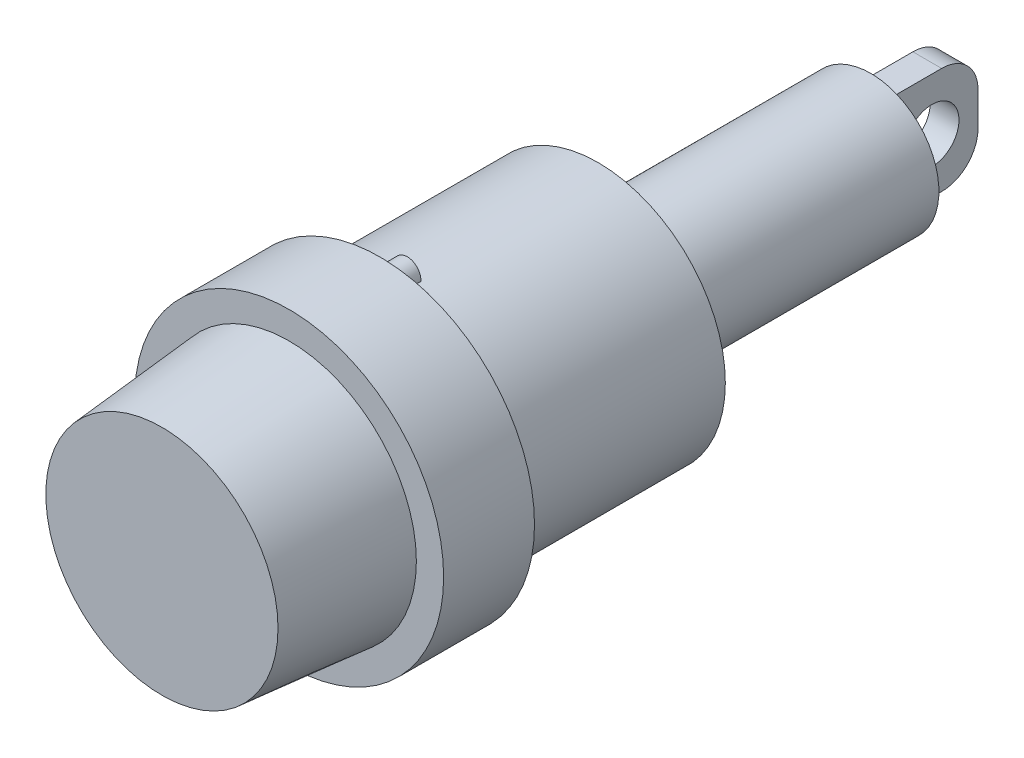
ISO-10303-21;
HEADER;
FILE_DESCRIPTION(('STEP AP214'),'2;1');
FILE_NAME('part.step','',(''),(''),'','','');
FILE_SCHEMA(('AUTOMOTIVE_DESIGN { 1 0 10303 214 1 1 1 1 }'));
ENDSEC;
DATA;
#1=APPLICATION_CONTEXT('core data for automotive mechanical design processes');
#2=APPLICATION_PROTOCOL_DEFINITION('international standard','automotive_design',2000,#1);
#3=PRODUCT_CONTEXT('',#1,'mechanical');
#4=PRODUCT('Part','Part','',(#3));
#5=PRODUCT_RELATED_PRODUCT_CATEGORY('part','',(#4));
#6=PRODUCT_DEFINITION_FORMATION('','',#4);
#7=PRODUCT_DEFINITION_CONTEXT('part definition',#1,'design');
#8=PRODUCT_DEFINITION('design','',#6,#7);
#9=PRODUCT_DEFINITION_SHAPE('','',#8);
#10=(LENGTH_UNIT() NAMED_UNIT(*) SI_UNIT(.MILLI.,.METRE.));
#11=(NAMED_UNIT(*) PLANE_ANGLE_UNIT() SI_UNIT($,.RADIAN.));
#12=(NAMED_UNIT(*) SI_UNIT($,.STERADIAN.) SOLID_ANGLE_UNIT());
#13=UNCERTAINTY_MEASURE_WITH_UNIT(LENGTH_MEASURE(1.E-05),#10,'distance_accuracy_value','');
#14=(GEOMETRIC_REPRESENTATION_CONTEXT(3) GLOBAL_UNCERTAINTY_ASSIGNED_CONTEXT((#13)) GLOBAL_UNIT_ASSIGNED_CONTEXT((#10,
#11,#12)) REPRESENTATION_CONTEXT('',''));
#15=CARTESIAN_POINT('',(0.,0.,0.));
#16=DIRECTION('',(0.,0.,1.));
#17=DIRECTION('',(1.,0.,0.));
#18=AXIS2_PLACEMENT_3D('',#15,#16,#17);
#19=CARTESIAN_POINT('',(0.,0.,0.));
#20=DIRECTION('',(0.,0.,1.));
#21=DIRECTION('',(1.,0.,0.));
#22=AXIS2_PLACEMENT_3D('',#19,#20,#21);
#23=PLANE('',#22);
#24=CARTESIAN_POINT('',(0.,0.,0.));
#25=DIRECTION('',(0.,0.,1.));
#26=DIRECTION('',(1.,0.,0.));
#27=AXIS2_PLACEMENT_3D('',#24,#25,#26);
#28=CIRCLE('',#27,8.5);
#29=CARTESIAN_POINT('',(8.5,0.,0.));
#30=VERTEX_POINT('',#29);
#31=EDGE_CURVE('E117',#30,#30,#28,.T.);
#32=ORIENTED_EDGE('',*,*,#31,.F.);
#33=EDGE_LOOP('',(#32));
#34=FACE_BOUND('',#33,.T.);
#35=CARTESIAN_POINT('',(0.,7.01066831383693,0.));
#36=DIRECTION('',(0.,0.,-1.));
#37=DIRECTION('',(-1.,0.,0.));
#38=AXIS2_PLACEMENT_3D('',#35,#36,#37);
#39=CIRCLE('',#38,0.75);
#40=CARTESIAN_POINT('',(-0.748279114072916,6.95989068645782,0.));
#41=VERTEX_POINT('',#40);
#42=CARTESIAN_POINT('',(0.748279114072916,6.95989068645782,0.));
#43=VERTEX_POINT('',#42);
#44=EDGE_CURVE('E97',#41,#43,#39,.T.);
#45=ORIENTED_EDGE('',*,*,#44,.F.);
#46=CARTESIAN_POINT('',(0.,0.,0.));
#47=DIRECTION('',(0.,0.,1.));
#48=DIRECTION('',(1.,0.,0.));
#49=AXIS2_PLACEMENT_3D('',#46,#47,#48);
#50=CIRCLE('',#49,7.);
#51=EDGE_CURVE('E108',#43,#41,#50,.F.);
#52=ORIENTED_EDGE('',*,*,#51,.F.);
#53=EDGE_LOOP('',(#45,#52));
#54=FACE_BOUND('',#53,.T.);
#55=ADVANCED_FACE('F34',(#34,#54),#23,.F.);
#56=CARTESIAN_POINT('',(0.,0.,-12.));
#57=DIRECTION('',(0.,0.,1.));
#58=DIRECTION('',(1.,0.,0.));
#59=AXIS2_PLACEMENT_3D('',#56,#57,#58);
#60=CYLINDRICAL_SURFACE('',#59,7.);
#61=CARTESIAN_POINT('',(0.,0.,-12.));
#62=DIRECTION('',(0.,0.,-1.));
#63=DIRECTION('',(-1.,0.,0.));
#64=AXIS2_PLACEMENT_3D('',#61,#62,#63);
#65=CIRCLE('',#64,7.);
#66=CARTESIAN_POINT('',(-7.,0.,-12.));
#67=VERTEX_POINT('',#66);
#68=EDGE_CURVE('E188',#67,#67,#65,.T.);
#69=ORIENTED_EDGE('',*,*,#68,.F.);
#70=EDGE_LOOP('',(#69));
#71=FACE_BOUND('',#70,.T.);
#72=DIRECTION('',(0.,0.,1.));
#73=VECTOR('',#72,1.);
#74=CARTESIAN_POINT('',(-0.748279114072916,6.95989068645782,-0.75));
#75=LINE('',#74,#73);
#76=CARTESIAN_POINT('',(-0.748279114072916,6.95989068645782,-1.5));
#77=VERTEX_POINT('',#76);
#78=EDGE_CURVE('E11',#77,#41,#75,.T.);
#79=ORIENTED_EDGE('',*,*,#78,.F.);
#80=CARTESIAN_POINT('',(0.,0.,-1.5));
#81=DIRECTION('',(0.,0.,-1.));
#82=DIRECTION('',(-1.,0.,0.));
#83=AXIS2_PLACEMENT_3D('',#80,#81,#82);
#84=CIRCLE('',#83,7.);
#85=CARTESIAN_POINT('',(0.748279114072916,6.95989068645782,-1.5));
#86=VERTEX_POINT('',#85);
#87=EDGE_CURVE('E109',#77,#86,#84,.T.);
#88=ORIENTED_EDGE('',*,*,#87,.T.);
#89=DIRECTION('',(0.,0.,1.));
#90=VECTOR('',#89,1.);
#91=CARTESIAN_POINT('',(0.748279114072916,6.95989068645782,-0.75));
#92=LINE('',#91,#90);
#93=EDGE_CURVE('E42',#43,#86,#92,.F.);
#94=ORIENTED_EDGE('',*,*,#93,.F.);
#95=ORIENTED_EDGE('',*,*,#51,.T.);
#96=EDGE_LOOP('',(#79,#88,#94,#95));
#97=FACE_BOUND('',#96,.T.);
#98=ADVANCED_FACE('F107',(#71,#97),#60,.T.);
#99=CARTESIAN_POINT('',(0.,0.,-27.));
#100=DIRECTION('',(0.,0.,-1.));
#101=DIRECTION('',(-1.,0.,0.));
#102=AXIS2_PLACEMENT_3D('',#99,#100,#101);
#103=PLANE('',#102);
#104=CARTESIAN_POINT('',(0.,0.,-27.));
#105=DIRECTION('',(0.,0.,-1.));
#106=DIRECTION('',(-1.,0.,0.));
#107=AXIS2_PLACEMENT_3D('',#104,#105,#106);
#108=CIRCLE('',#107,3.75);
#109=CARTESIAN_POINT('',(-3.75,0.,-27.));
#110=VERTEX_POINT('',#109);
#111=EDGE_CURVE('E185',#110,#110,#108,.T.);
#112=ORIENTED_EDGE('',*,*,#111,.T.);
#113=EDGE_LOOP('',(#112));
#114=FACE_BOUND('',#113,.T.);
#115=DIRECTION('',(-1.,0.,0.));
#116=VECTOR('',#115,1.);
#117=CARTESIAN_POINT('',(0.901291343113623,-2.93469254404056,-27.));
#118=LINE('',#117,#116);
#119=CARTESIAN_POINT('',(0.901291343113623,-2.93469254404056,-27.));
#120=VERTEX_POINT('',#119);
#121=CARTESIAN_POINT('',(-0.681464186256642,-2.93469254404056,-27.));
#122=VERTEX_POINT('',#121);
#123=EDGE_CURVE('E176',#120,#122,#118,.T.);
#124=ORIENTED_EDGE('',*,*,#123,.F.);
#125=DIRECTION('',(0.,-1.,0.));
#126=VECTOR('',#125,1.);
#127=CARTESIAN_POINT('',(0.901291343113623,2.93469254404083,-27.));
#128=LINE('',#127,#126);
#129=CARTESIAN_POINT('',(0.901291343113623,2.93469254404083,-27.));
#130=VERTEX_POINT('',#129);
#131=EDGE_CURVE('E123',#130,#120,#128,.T.);
#132=ORIENTED_EDGE('',*,*,#131,.F.);
#133=DIRECTION('',(1.,0.,0.));
#134=VECTOR('',#133,1.);
#135=CARTESIAN_POINT('',(0.901291343113623,2.93469254404083,-27.));
#136=LINE('',#135,#134);
#137=CARTESIAN_POINT('',(-0.681464186256642,2.93469254404083,-27.));
#138=VERTEX_POINT('',#137);
#139=EDGE_CURVE('E168',#138,#130,#136,.T.);
#140=ORIENTED_EDGE('',*,*,#139,.F.);
#141=DIRECTION('',(0.,1.,0.));
#142=VECTOR('',#141,1.);
#143=CARTESIAN_POINT('',(-0.681464186256642,2.93469254404083,-27.));
#144=LINE('',#143,#142);
#145=EDGE_CURVE('E154',#122,#138,#144,.T.);
#146=ORIENTED_EDGE('',*,*,#145,.F.);
#147=EDGE_LOOP('',(#124,#132,#140,#146));
#148=FACE_BOUND('',#147,.T.);
#149=ADVANCED_FACE('F210',(#114,#148),#103,.T.);
#150=CARTESIAN_POINT('',(0.,0.,-12.));
#151=DIRECTION('',(0.,0.,-1.));
#152=DIRECTION('',(-1.,0.,0.));
#153=AXIS2_PLACEMENT_3D('',#150,#151,#152);
#154=PLANE('',#153);
#155=ORIENTED_EDGE('',*,*,#68,.T.);
#156=EDGE_LOOP('',(#155));
#157=FACE_BOUND('',#156,.T.);
#158=CARTESIAN_POINT('',(0.,0.,-12.));
#159=DIRECTION('',(0.,0.,-1.));
#160=DIRECTION('',(-1.,0.,0.));
#161=AXIS2_PLACEMENT_3D('',#158,#159,#160);
#162=CIRCLE('',#161,3.75);
#163=CARTESIAN_POINT('',(-3.75,0.,-12.));
#164=VERTEX_POINT('',#163);
#165=EDGE_CURVE('E184',#164,#164,#162,.T.);
#166=ORIENTED_EDGE('',*,*,#165,.F.);
#167=EDGE_LOOP('',(#166));
#168=FACE_BOUND('',#167,.T.);
#169=ADVANCED_FACE('F238',(#157,#168),#154,.T.);
#170=CARTESIAN_POINT('',(0.,0.,5.));
#171=DIRECTION('',(0.,0.,1.));
#172=DIRECTION('',(1.,0.,0.));
#173=AXIS2_PLACEMENT_3D('',#170,#171,#172);
#174=PLANE('',#173);
#175=CARTESIAN_POINT('',(0.,0.,5.));
#176=DIRECTION('',(0.,0.,1.));
#177=DIRECTION('',(1.,0.,0.));
#178=AXIS2_PLACEMENT_3D('',#175,#176,#177);
#179=CIRCLE('',#178,8.5);
#180=CARTESIAN_POINT('',(8.5,0.,5.));
#181=VERTEX_POINT('',#180);
#182=EDGE_CURVE('E111',#181,#181,#179,.T.);
#183=ORIENTED_EDGE('',*,*,#182,.T.);
#184=EDGE_LOOP('',(#183));
#185=FACE_BOUND('',#184,.T.);
#186=CARTESIAN_POINT('',(0.,0.,5.));
#187=DIRECTION('',(0.,0.,1.));
#188=DIRECTION('',(1.,0.,0.));
#189=AXIS2_PLACEMENT_3D('',#186,#187,#188);
#190=CIRCLE('',#189,7.);
#191=CARTESIAN_POINT('',(7.,0.,5.));
#192=VERTEX_POINT('',#191);
#193=EDGE_CURVE('E193',#192,#192,#190,.T.);
#194=ORIENTED_EDGE('',*,*,#193,.F.);
#195=EDGE_LOOP('',(#194));
#196=FACE_BOUND('',#195,.T.);
#197=ADVANCED_FACE('F215',(#185,#196),#174,.T.);
#198=CARTESIAN_POINT('',(0.,0.,5.));
#199=DIRECTION('',(0.,0.,-1.));
#200=DIRECTION('',(-1.,0.,0.));
#201=AXIS2_PLACEMENT_3D('',#198,#199,#200);
#202=CYLINDRICAL_SURFACE('',#201,8.5);
#203=ORIENTED_EDGE('',*,*,#182,.F.);
#204=EDGE_LOOP('',(#203));
#205=FACE_BOUND('',#204,.T.);
#206=ORIENTED_EDGE('',*,*,#31,.T.);
#207=EDGE_LOOP('',(#206));
#208=FACE_BOUND('',#207,.T.);
#209=ADVANCED_FACE('F203',(#205,#208),#202,.T.);
#210=CARTESIAN_POINT('',(0.,0.,5.));
#211=DIRECTION('',(0.,0.,-1.));
#212=DIRECTION('',(1.,0.,0.));
#213=AXIS2_PLACEMENT_3D('',#210,#211,#212);
#214=CONICAL_SURFACE('',#213,7.,0.0872664625997167);
#215=CARTESIAN_POINT('',(0.,0.,12.));
#216=DIRECTION('',(0.,0.,1.));
#217=DIRECTION('',(1.,0.,0.));
#218=AXIS2_PLACEMENT_3D('',#215,#216,#217);
#219=CIRCLE('',#218,6.38757935531853);
#220=CARTESIAN_POINT('',(6.38757935531853,0.,12.));
#221=VERTEX_POINT('',#220);
#222=EDGE_CURVE('E196',#221,#221,#219,.T.);
#223=ORIENTED_EDGE('',*,*,#222,.F.);
#224=EDGE_LOOP('',(#223));
#225=FACE_BOUND('',#224,.T.);
#226=ORIENTED_EDGE('',*,*,#193,.T.);
#227=EDGE_LOOP('',(#226));
#228=FACE_BOUND('',#227,.T.);
#229=ADVANCED_FACE('F218',(#225,#228),#214,.T.);
#230=CARTESIAN_POINT('',(0.,0.,12.));
#231=DIRECTION('',(0.,0.,1.));
#232=DIRECTION('',(1.,0.,0.));
#233=AXIS2_PLACEMENT_3D('',#230,#231,#232);
#234=PLANE('',#233);
#235=ORIENTED_EDGE('',*,*,#222,.T.);
#236=EDGE_LOOP('',(#235));
#237=FACE_BOUND('',#236,.T.);
#238=ADVANCED_FACE('F251',(#237),#234,.T.);
#239=CARTESIAN_POINT('',(0.,0.,-27.));
#240=DIRECTION('',(0.,0.,1.));
#241=DIRECTION('',(1.,0.,0.));
#242=AXIS2_PLACEMENT_3D('',#239,#240,#241);
#243=CYLINDRICAL_SURFACE('',#242,3.75);
#244=ORIENTED_EDGE('',*,*,#111,.F.);
#245=EDGE_LOOP('',(#244));
#246=FACE_BOUND('',#245,.T.);
#247=ORIENTED_EDGE('',*,*,#165,.T.);
#248=EDGE_LOOP('',(#247));
#249=FACE_BOUND('',#248,.T.);
#250=ADVANCED_FACE('F249',(#246,#249),#243,.T.);
#251=CARTESIAN_POINT('',(0.901291343113623,2.93469254404083,-32.));
#252=DIRECTION('',(-1.,0.,0.));
#253=DIRECTION('',(0.,0.,1.));
#254=AXIS2_PLACEMENT_3D('',#251,#252,#253);
#255=PLANE('',#254);
#256=CARTESIAN_POINT('',(0.901291343113623,0.,-29.4674951634494));
#257=DIRECTION('',(1.,0.,0.));
#258=DIRECTION('',(0.,0.,-1.));
#259=AXIS2_PLACEMENT_3D('',#256,#257,#258);
#260=CIRCLE('',#259,1.48410827691468);
#261=CARTESIAN_POINT('',(0.901291343113623,0.,-30.9516034403641));
#262=VERTEX_POINT('',#261);
#263=EDGE_CURVE('E124',#262,#262,#260,.T.);
#264=ORIENTED_EDGE('',*,*,#263,.F.);
#265=EDGE_LOOP('',(#264));
#266=FACE_BOUND('',#265,.T.);
#267=DIRECTION('',(0.,0.,1.));
#268=VECTOR('',#267,1.);
#269=CARTESIAN_POINT('',(0.901291343113623,-2.93469254404056,-32.));
#270=LINE('',#269,#268);
#271=CARTESIAN_POINT('',(0.901291343113623,-2.93469254404056,-30.));
#272=VERTEX_POINT('',#271);
#273=EDGE_CURVE('E182',#272,#120,#270,.T.);
#274=ORIENTED_EDGE('',*,*,#273,.F.);
#275=CARTESIAN_POINT('',(0.901291343113623,-0.934692544040557,-30.));
#276=DIRECTION('',(-1.,0.,0.));
#277=DIRECTION('',(0.,0.,1.));
#278=AXIS2_PLACEMENT_3D('',#275,#276,#277);
#279=CIRCLE('',#278,2.);
#280=CARTESIAN_POINT('',(0.901291343113623,-0.934692544040557,-32.));
#281=VERTEX_POINT('',#280);
#282=EDGE_CURVE('E135',#272,#281,#279,.F.);
#283=ORIENTED_EDGE('',*,*,#282,.T.);
#284=DIRECTION('',(0.,-1.,0.));
#285=VECTOR('',#284,1.);
#286=CARTESIAN_POINT('',(0.901291343113623,2.93469254404083,-32.));
#287=LINE('',#286,#285);
#288=CARTESIAN_POINT('',(0.901291343113623,0.934692544040831,-32.));
#289=VERTEX_POINT('',#288);
#290=EDGE_CURVE('E162',#289,#281,#287,.T.);
#291=ORIENTED_EDGE('',*,*,#290,.F.);
#292=CARTESIAN_POINT('',(0.901291343113623,0.934692544040831,-30.));
#293=DIRECTION('',(-1.,0.,0.));
#294=DIRECTION('',(0.,0.,1.));
#295=AXIS2_PLACEMENT_3D('',#292,#293,#294);
#296=CIRCLE('',#295,2.);
#297=CARTESIAN_POINT('',(0.901291343113623,2.93469254404083,-30.));
#298=VERTEX_POINT('',#297);
#299=EDGE_CURVE('E56',#289,#298,#296,.F.);
#300=ORIENTED_EDGE('',*,*,#299,.T.);
#301=DIRECTION('',(0.,0.,1.));
#302=VECTOR('',#301,1.);
#303=CARTESIAN_POINT('',(0.901291343113623,2.93469254404083,-32.));
#304=LINE('',#303,#302);
#305=EDGE_CURVE('E146',#298,#130,#304,.T.);
#306=ORIENTED_EDGE('',*,*,#305,.T.);
#307=ORIENTED_EDGE('',*,*,#131,.T.);
#308=EDGE_LOOP('',(#274,#283,#291,#300,#306,#307));
#309=FACE_BOUND('',#308,.T.);
#310=ADVANCED_FACE('F166',(#266,#309),#255,.F.);
#311=CARTESIAN_POINT('',(0.901291343113623,-2.93469254404056,-32.));
#312=DIRECTION('',(0.,1.,0.));
#313=DIRECTION('',(0.,0.,1.));
#314=AXIS2_PLACEMENT_3D('',#311,#312,#313);
#315=PLANE('',#314);
#316=DIRECTION('',(0.,0.,1.));
#317=VECTOR('',#316,1.);
#318=CARTESIAN_POINT('',(-0.681464186256642,-2.93469254404056,-32.));
#319=LINE('',#318,#317);
#320=CARTESIAN_POINT('',(-0.681464186256642,-2.93469254404056,-30.));
#321=VERTEX_POINT('',#320);
#322=EDGE_CURVE('E156',#321,#122,#319,.T.);
#323=ORIENTED_EDGE('',*,*,#322,.F.);
#324=DIRECTION('',(-1.,0.,0.));
#325=VECTOR('',#324,1.);
#326=CARTESIAN_POINT('',(0.901291343113623,-2.93469254404056,-30.));
#327=LINE('',#326,#325);
#328=EDGE_CURVE('E132',#321,#272,#327,.F.);
#329=ORIENTED_EDGE('',*,*,#328,.T.);
#330=ORIENTED_EDGE('',*,*,#273,.T.);
#331=ORIENTED_EDGE('',*,*,#123,.T.);
#332=EDGE_LOOP('',(#323,#329,#330,#331));
#333=FACE_BOUND('',#332,.T.);
#334=ADVANCED_FACE('F233',(#333),#315,.F.);
#335=CARTESIAN_POINT('',(-0.681464186256642,2.93469254404083,-32.));
#336=DIRECTION('',(1.,0.,0.));
#337=DIRECTION('',(0.,0.,-1.));
#338=AXIS2_PLACEMENT_3D('',#335,#336,#337);
#339=PLANE('',#338);
#340=CARTESIAN_POINT('',(-0.681464186256642,0.,-29.4674951634494));
#341=DIRECTION('',(1.,0.,0.));
#342=DIRECTION('',(0.,0.,-1.));
#343=AXIS2_PLACEMENT_3D('',#340,#341,#342);
#344=CIRCLE('',#343,1.48410827691468);
#345=CARTESIAN_POINT('',(-0.681464186256642,0.,-30.9516034403641));
#346=VERTEX_POINT('',#345);
#347=EDGE_CURVE('E121',#346,#346,#344,.T.);
#348=ORIENTED_EDGE('',*,*,#347,.T.);
#349=EDGE_LOOP('',(#348));
#350=FACE_BOUND('',#349,.T.);
#351=DIRECTION('',(0.,1.,0.));
#352=VECTOR('',#351,1.);
#353=CARTESIAN_POINT('',(-0.681464186256642,2.93469254404083,-32.));
#354=LINE('',#353,#352);
#355=CARTESIAN_POINT('',(-0.681464186256642,-0.934692544040557,-32.));
#356=VERTEX_POINT('',#355);
#357=CARTESIAN_POINT('',(-0.681464186256642,0.934692544040831,-32.));
#358=VERTEX_POINT('',#357);
#359=EDGE_CURVE('E164',#356,#358,#354,.T.);
#360=ORIENTED_EDGE('',*,*,#359,.F.);
#361=CARTESIAN_POINT('',(-0.681464186256642,-0.934692544040557,-30.));
#362=DIRECTION('',(1.,0.,0.));
#363=DIRECTION('',(0.,0.,-1.));
#364=AXIS2_PLACEMENT_3D('',#361,#362,#363);
#365=CIRCLE('',#364,2.);
#366=EDGE_CURVE('E130',#356,#321,#365,.F.);
#367=ORIENTED_EDGE('',*,*,#366,.T.);
#368=ORIENTED_EDGE('',*,*,#322,.T.);
#369=ORIENTED_EDGE('',*,*,#145,.T.);
#370=DIRECTION('',(0.,0.,1.));
#371=VECTOR('',#370,1.);
#372=CARTESIAN_POINT('',(-0.681464186256642,2.93469254404083,-32.));
#373=LINE('',#372,#371);
#374=CARTESIAN_POINT('',(-0.681464186256642,2.93469254404083,-30.));
#375=VERTEX_POINT('',#374);
#376=EDGE_CURVE('E144',#375,#138,#373,.T.);
#377=ORIENTED_EDGE('',*,*,#376,.F.);
#378=CARTESIAN_POINT('',(-0.681464186256642,0.934692544040831,-30.));
#379=DIRECTION('',(1.,0.,0.));
#380=DIRECTION('',(0.,0.,-1.));
#381=AXIS2_PLACEMENT_3D('',#378,#379,#380);
#382=CIRCLE('',#381,2.);
#383=EDGE_CURVE('E128',#375,#358,#382,.F.);
#384=ORIENTED_EDGE('',*,*,#383,.T.);
#385=EDGE_LOOP('',(#360,#367,#368,#369,#377,#384));
#386=FACE_BOUND('',#385,.T.);
#387=ADVANCED_FACE('F151',(#350,#386),#339,.F.);
#388=CARTESIAN_POINT('',(0.901291343113623,2.93469254404083,-32.));
#389=DIRECTION('',(0.,-1.,0.));
#390=DIRECTION('',(0.,0.,-1.));
#391=AXIS2_PLACEMENT_3D('',#388,#389,#390);
#392=PLANE('',#391);
#393=ORIENTED_EDGE('',*,*,#305,.F.);
#394=DIRECTION('',(1.,0.,0.));
#395=VECTOR('',#394,1.);
#396=CARTESIAN_POINT('',(-0.681464186256642,2.93469254404083,-30.));
#397=LINE('',#396,#395);
#398=EDGE_CURVE('E137',#298,#375,#397,.F.);
#399=ORIENTED_EDGE('',*,*,#398,.T.);
#400=ORIENTED_EDGE('',*,*,#376,.T.);
#401=ORIENTED_EDGE('',*,*,#139,.T.);
#402=EDGE_LOOP('',(#393,#399,#400,#401));
#403=FACE_BOUND('',#402,.T.);
#404=ADVANCED_FACE('F142',(#403),#392,.F.);
#405=CARTESIAN_POINT('',(0.901291343113623,-2.93469254404056,-32.));
#406=DIRECTION('',(0.,0.,-1.));
#407=DIRECTION('',(-1.,0.,0.));
#408=AXIS2_PLACEMENT_3D('',#405,#406,#407);
#409=PLANE('',#408);
#410=ORIENTED_EDGE('',*,*,#290,.T.);
#411=DIRECTION('',(-1.,0.,0.));
#412=VECTOR('',#411,1.);
#413=CARTESIAN_POINT('',(-0.681464186256642,-0.934692544040557,-32.));
#414=LINE('',#413,#412);
#415=EDGE_CURVE('E114',#281,#356,#414,.T.);
#416=ORIENTED_EDGE('',*,*,#415,.T.);
#417=ORIENTED_EDGE('',*,*,#359,.T.);
#418=DIRECTION('',(1.,0.,0.));
#419=VECTOR('',#418,1.);
#420=CARTESIAN_POINT('',(0.901291343113623,0.934692544040831,-32.));
#421=LINE('',#420,#419);
#422=EDGE_CURVE('E110',#358,#289,#421,.T.);
#423=ORIENTED_EDGE('',*,*,#422,.T.);
#424=EDGE_LOOP('',(#410,#416,#417,#423));
#425=FACE_BOUND('',#424,.T.);
#426=ADVANCED_FACE('F161',(#425),#409,.T.);
#427=CARTESIAN_POINT('',(-4.09870865688638,0.,-29.4674951634494));
#428=DIRECTION('',(1.,0.,0.));
#429=DIRECTION('',(0.,0.,-1.));
#430=AXIS2_PLACEMENT_3D('',#427,#428,#429);
#431=CYLINDRICAL_SURFACE('',#430,1.48410827691468);
#432=ORIENTED_EDGE('',*,*,#263,.T.);
#433=EDGE_LOOP('',(#432));
#434=FACE_BOUND('',#433,.T.);
#435=ORIENTED_EDGE('',*,*,#347,.F.);
#436=EDGE_LOOP('',(#435));
#437=FACE_BOUND('',#436,.T.);
#438=ADVANCED_FACE('F222',(#434,#437),#431,.F.);
#439=CARTESIAN_POINT('',(0.901291343113623,-0.934692544040557,-30.));
#440=DIRECTION('',(1.,0.,0.));
#441=DIRECTION('',(0.,0.,-1.));
#442=AXIS2_PLACEMENT_3D('',#439,#440,#441);
#443=CYLINDRICAL_SURFACE('',#442,2.);
#444=ORIENTED_EDGE('',*,*,#282,.F.);
#445=ORIENTED_EDGE('',*,*,#328,.F.);
#446=ORIENTED_EDGE('',*,*,#366,.F.);
#447=ORIENTED_EDGE('',*,*,#415,.F.);
#448=EDGE_LOOP('',(#444,#445,#446,#447));
#449=FACE_BOUND('',#448,.T.);
#450=ADVANCED_FACE('F220',(#449),#443,.T.);
#451=CARTESIAN_POINT('',(0.901291343113623,0.934692544040831,-30.));
#452=DIRECTION('',(-1.,0.,0.));
#453=DIRECTION('',(0.,0.,1.));
#454=AXIS2_PLACEMENT_3D('',#451,#452,#453);
#455=CYLINDRICAL_SURFACE('',#454,2.);
#456=ORIENTED_EDGE('',*,*,#383,.F.);
#457=ORIENTED_EDGE('',*,*,#398,.F.);
#458=ORIENTED_EDGE('',*,*,#299,.F.);
#459=ORIENTED_EDGE('',*,*,#422,.F.);
#460=EDGE_LOOP('',(#456,#457,#458,#459));
#461=FACE_BOUND('',#460,.T.);
#462=ADVANCED_FACE('F36',(#461),#455,.T.);
#463=CARTESIAN_POINT('',(0.,7.01066831383693,-1.5));
#464=DIRECTION('',(0.,0.,1.));
#465=DIRECTION('',(1.,0.,0.));
#466=AXIS2_PLACEMENT_3D('',#463,#464,#465);
#467=CYLINDRICAL_SURFACE('',#466,0.75);
#468=CARTESIAN_POINT('',(0.,7.01066831383693,-1.5));
#469=DIRECTION('',(0.,0.,-1.));
#470=DIRECTION('',(-1.,0.,0.));
#471=AXIS2_PLACEMENT_3D('',#468,#469,#470);
#472=CIRCLE('',#471,0.75);
#473=EDGE_CURVE('E48',#77,#86,#472,.T.);
#474=ORIENTED_EDGE('',*,*,#473,.F.);
#475=ORIENTED_EDGE('',*,*,#78,.T.);
#476=ORIENTED_EDGE('',*,*,#44,.T.);
#477=ORIENTED_EDGE('',*,*,#93,.T.);
#478=EDGE_LOOP('',(#474,#475,#476,#477));
#479=FACE_BOUND('',#478,.T.);
#480=ADVANCED_FACE('F99',(#479),#467,.T.);
#481=CARTESIAN_POINT('',(0.,7.01066831383693,-1.5));
#482=DIRECTION('',(0.,0.,-1.));
#483=DIRECTION('',(-1.,0.,0.));
#484=AXIS2_PLACEMENT_3D('',#481,#482,#483);
#485=PLANE('',#484);
#486=ORIENTED_EDGE('',*,*,#87,.F.);
#487=ORIENTED_EDGE('',*,*,#473,.T.);
#488=EDGE_LOOP('',(#486,#487));
#489=FACE_BOUND('',#488,.T.);
#490=ADVANCED_FACE('F300',(#489),#485,.T.);
#491=CLOSED_SHELL('',(#55,#98,#149,#169,#197,#209,#229,#238,#250,#310,#334,#387,#404,#426,#438,
#450,#462,#480,#490));
#492=MANIFOLD_SOLID_BREP('B2',#491);
#493=ADVANCED_BREP_SHAPE_REPRESENTATION('',(#18,#492),#14);
#494=SHAPE_DEFINITION_REPRESENTATION(#9,#493);
ENDSEC;
END-ISO-10303-21;
